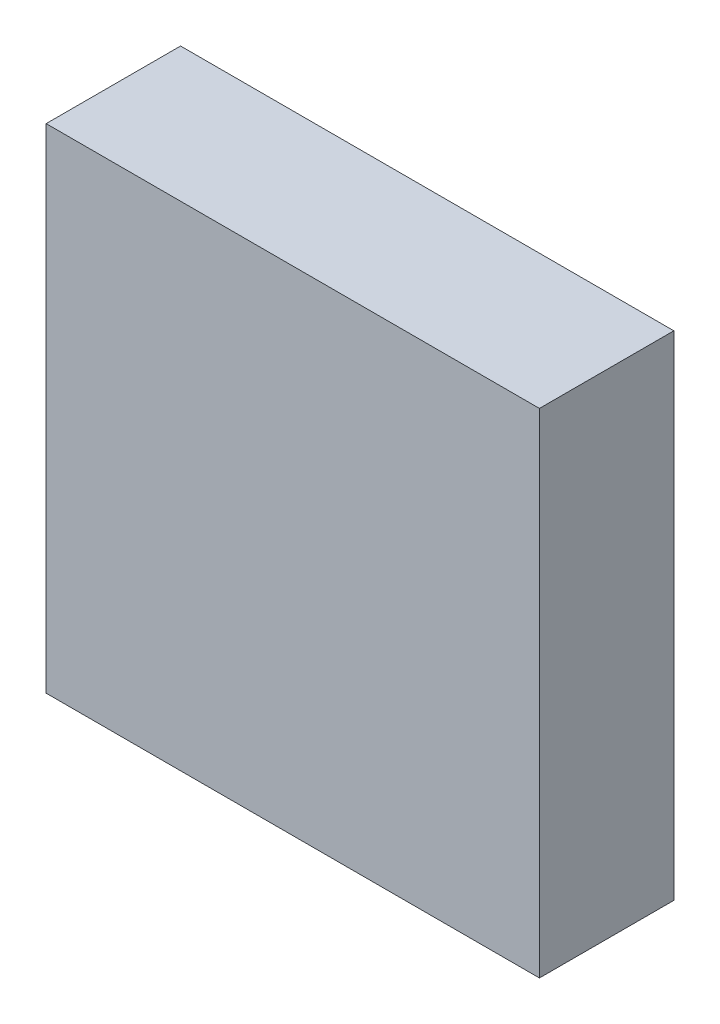
ISO-10303-21;
HEADER;
FILE_DESCRIPTION(('STEP AP214'),'2;1');
FILE_NAME('part.step','',(''),(''),'','','');
FILE_SCHEMA(('AUTOMOTIVE_DESIGN { 1 0 10303 214 1 1 1 1 }'));
ENDSEC;
DATA;
#1=APPLICATION_CONTEXT('core data for automotive mechanical design processes');
#2=APPLICATION_PROTOCOL_DEFINITION('international standard','automotive_design',2000,#1);
#3=PRODUCT_CONTEXT('',#1,'mechanical');
#4=PRODUCT('Part','Part','',(#3));
#5=PRODUCT_RELATED_PRODUCT_CATEGORY('part','',(#4));
#6=PRODUCT_DEFINITION_FORMATION('','',#4);
#7=PRODUCT_DEFINITION_CONTEXT('part definition',#1,'design');
#8=PRODUCT_DEFINITION('design','',#6,#7);
#9=PRODUCT_DEFINITION_SHAPE('','',#8);
#10=(LENGTH_UNIT() NAMED_UNIT(*) SI_UNIT(.MILLI.,.METRE.));
#11=(NAMED_UNIT(*) PLANE_ANGLE_UNIT() SI_UNIT($,.RADIAN.));
#12=(NAMED_UNIT(*) SI_UNIT($,.STERADIAN.) SOLID_ANGLE_UNIT());
#13=UNCERTAINTY_MEASURE_WITH_UNIT(LENGTH_MEASURE(1.E-05),#10,'distance_accuracy_value','');
#14=(GEOMETRIC_REPRESENTATION_CONTEXT(3) GLOBAL_UNCERTAINTY_ASSIGNED_CONTEXT((#13)) GLOBAL_UNIT_ASSIGNED_CONTEXT((#10,
#11,#12)) REPRESENTATION_CONTEXT('',''));
#15=CARTESIAN_POINT('',(0.,0.,0.));
#16=DIRECTION('',(0.,0.,1.));
#17=DIRECTION('',(1.,0.,0.));
#18=AXIS2_PLACEMENT_3D('',#15,#16,#17);
#19=CARTESIAN_POINT('',(-1.99999854,-2.00000108,1.09000036));
#20=DIRECTION('',(0.,0.,1.));
#21=DIRECTION('',(1.,0.,0.));
#22=AXIS2_PLACEMENT_3D('',#19,#20,#21);
#23=PLANE('',#22);
#24=DIRECTION('',(1.,0.,0.));
#25=VECTOR('',#24,1.);
#26=CARTESIAN_POINT('',(-1.99999854,1.99999854,1.09000036));
#27=LINE('',#26,#25);
#28=CARTESIAN_POINT('',(-1.99999854,1.99999854,1.09000036));
#29=VERTEX_POINT('',#28);
#30=CARTESIAN_POINT('',(2.00000108,1.99999854,1.09000036));
#31=VERTEX_POINT('',#30);
#32=EDGE_CURVE('E52',#29,#31,#27,.T.);
#33=ORIENTED_EDGE('',*,*,#32,.F.);
#34=DIRECTION('',(0.,1.,0.));
#35=VECTOR('',#34,1.);
#36=CARTESIAN_POINT('',(-1.99999854,-2.00000108,1.09000036));
#37=LINE('',#36,#35);
#38=CARTESIAN_POINT('',(-1.99999854,-2.00000108,1.09000036));
#39=VERTEX_POINT('',#38);
#40=EDGE_CURVE('E67',#39,#29,#37,.T.);
#41=ORIENTED_EDGE('',*,*,#40,.F.);
#42=DIRECTION('',(1.,0.,0.));
#43=VECTOR('',#42,1.);
#44=CARTESIAN_POINT('',(2.00000108,-2.00000108,1.09000036));
#45=LINE('',#44,#43);
#46=CARTESIAN_POINT('',(2.00000108,-2.00000108,1.09000036));
#47=VERTEX_POINT('',#46);
#48=EDGE_CURVE('E19',#47,#39,#45,.F.);
#49=ORIENTED_EDGE('',*,*,#48,.F.);
#50=DIRECTION('',(0.,1.,0.));
#51=VECTOR('',#50,1.);
#52=CARTESIAN_POINT('',(2.00000108,1.99999854,1.09000036));
#53=LINE('',#52,#51);
#54=EDGE_CURVE('E57',#31,#47,#53,.F.);
#55=ORIENTED_EDGE('',*,*,#54,.F.);
#56=EDGE_LOOP('',(#33,#41,#49,#55));
#57=FACE_BOUND('',#56,.T.);
#58=ADVANCED_FACE('F16',(#57),#23,.T.);
#59=CARTESIAN_POINT('',(2.00000108,-2.00000108,0.));
#60=DIRECTION('',(0.,-1.,0.));
#61=DIRECTION('',(0.,0.,-1.));
#62=AXIS2_PLACEMENT_3D('',#59,#60,#61);
#63=PLANE('',#62);
#64=DIRECTION('',(0.,0.,1.));
#65=VECTOR('',#64,1.);
#66=CARTESIAN_POINT('',(-1.99999854,-2.00000108,0.));
#67=LINE('',#66,#65);
#68=CARTESIAN_POINT('',(-1.99999854,-2.00000108,0.));
#69=VERTEX_POINT('',#68);
#70=EDGE_CURVE('E78',#69,#39,#67,.T.);
#71=ORIENTED_EDGE('',*,*,#70,.F.);
#72=DIRECTION('',(1.,0.,0.));
#73=VECTOR('',#72,1.);
#74=CARTESIAN_POINT('',(-1.99999854,-2.00000108,0.));
#75=LINE('',#74,#73);
#76=CARTESIAN_POINT('',(2.00000108,-2.00000108,0.));
#77=VERTEX_POINT('',#76);
#78=EDGE_CURVE('E73',#69,#77,#75,.T.);
#79=ORIENTED_EDGE('',*,*,#78,.T.);
#80=DIRECTION('',(0.,0.,-1.));
#81=VECTOR('',#80,1.);
#82=CARTESIAN_POINT('',(2.00000108,-2.00000108,0.));
#83=LINE('',#82,#81);
#84=EDGE_CURVE('E62',#47,#77,#83,.T.);
#85=ORIENTED_EDGE('',*,*,#84,.F.);
#86=ORIENTED_EDGE('',*,*,#48,.T.);
#87=EDGE_LOOP('',(#71,#79,#85,#86));
#88=FACE_BOUND('',#87,.T.);
#89=ADVANCED_FACE('F72',(#88),#63,.T.);
#90=CARTESIAN_POINT('',(2.00000108,1.99999854,0.));
#91=DIRECTION('',(1.,0.,0.));
#92=DIRECTION('',(0.,0.,-1.));
#93=AXIS2_PLACEMENT_3D('',#90,#91,#92);
#94=PLANE('',#93);
#95=ORIENTED_EDGE('',*,*,#84,.T.);
#96=DIRECTION('',(0.,1.,0.));
#97=VECTOR('',#96,1.);
#98=CARTESIAN_POINT('',(2.00000108,-2.00000108,0.));
#99=LINE('',#98,#97);
#100=CARTESIAN_POINT('',(2.00000108,1.99999854,0.));
#101=VERTEX_POINT('',#100);
#102=EDGE_CURVE('E83',#77,#101,#99,.T.);
#103=ORIENTED_EDGE('',*,*,#102,.T.);
#104=DIRECTION('',(0.,0.,1.));
#105=VECTOR('',#104,1.);
#106=CARTESIAN_POINT('',(2.00000108,1.99999854,0.));
#107=LINE('',#106,#105);
#108=EDGE_CURVE('E64',#31,#101,#107,.F.);
#109=ORIENTED_EDGE('',*,*,#108,.F.);
#110=ORIENTED_EDGE('',*,*,#54,.T.);
#111=EDGE_LOOP('',(#95,#103,#109,#110));
#112=FACE_BOUND('',#111,.T.);
#113=ADVANCED_FACE('F59',(#112),#94,.T.);
#114=CARTESIAN_POINT('',(-1.99999854,1.99999854,0.));
#115=DIRECTION('',(0.,1.,0.));
#116=DIRECTION('',(0.,0.,1.));
#117=AXIS2_PLACEMENT_3D('',#114,#115,#116);
#118=PLANE('',#117);
#119=ORIENTED_EDGE('',*,*,#108,.T.);
#120=DIRECTION('',(1.,0.,0.));
#121=VECTOR('',#120,1.);
#122=CARTESIAN_POINT('',(-1.99999854,1.99999854,0.));
#123=LINE('',#122,#121);
#124=CARTESIAN_POINT('',(-1.99999854,1.99999854,0.));
#125=VERTEX_POINT('',#124);
#126=EDGE_CURVE('E25',#101,#125,#123,.F.);
#127=ORIENTED_EDGE('',*,*,#126,.T.);
#128=DIRECTION('',(0.,0.,1.));
#129=VECTOR('',#128,1.);
#130=CARTESIAN_POINT('',(-1.99999854,1.99999854,0.));
#131=LINE('',#130,#129);
#132=EDGE_CURVE('E33',#29,#125,#131,.F.);
#133=ORIENTED_EDGE('',*,*,#132,.F.);
#134=ORIENTED_EDGE('',*,*,#32,.T.);
#135=EDGE_LOOP('',(#119,#127,#133,#134));
#136=FACE_BOUND('',#135,.T.);
#137=ADVANCED_FACE('F87',(#136),#118,.T.);
#138=CARTESIAN_POINT('',(-1.99999854,-2.00000108,0.));
#139=DIRECTION('',(-1.,0.,0.));
#140=DIRECTION('',(0.,0.,1.));
#141=AXIS2_PLACEMENT_3D('',#138,#139,#140);
#142=PLANE('',#141);
#143=ORIENTED_EDGE('',*,*,#132,.T.);
#144=DIRECTION('',(0.,1.,0.));
#145=VECTOR('',#144,1.);
#146=CARTESIAN_POINT('',(-1.99999854,-2.00000108,0.));
#147=LINE('',#146,#145);
#148=EDGE_CURVE('E10',#125,#69,#147,.F.);
#149=ORIENTED_EDGE('',*,*,#148,.T.);
#150=ORIENTED_EDGE('',*,*,#70,.T.);
#151=ORIENTED_EDGE('',*,*,#40,.T.);
#152=EDGE_LOOP('',(#143,#149,#150,#151));
#153=FACE_BOUND('',#152,.T.);
#154=ADVANCED_FACE('F90',(#153),#142,.T.);
#155=CARTESIAN_POINT('',(-1.99999854,-2.00000108,0.));
#156=DIRECTION('',(0.,0.,1.));
#157=DIRECTION('',(1.,0.,0.));
#158=AXIS2_PLACEMENT_3D('',#155,#156,#157);
#159=PLANE('',#158);
#160=ORIENTED_EDGE('',*,*,#126,.F.);
#161=ORIENTED_EDGE('',*,*,#102,.F.);
#162=ORIENTED_EDGE('',*,*,#78,.F.);
#163=ORIENTED_EDGE('',*,*,#148,.F.);
#164=EDGE_LOOP('',(#160,#161,#162,#163));
#165=FACE_BOUND('',#164,.T.);
#166=ADVANCED_FACE('F89',(#165),#159,.F.);
#167=CLOSED_SHELL('',(#58,#89,#113,#137,#154,#166));
#168=MANIFOLD_SOLID_BREP('B1',#167);
#169=ADVANCED_BREP_SHAPE_REPRESENTATION('',(#18,#168),#14);
#170=SHAPE_DEFINITION_REPRESENTATION(#9,#169);
ENDSEC;
END-ISO-10303-21;
